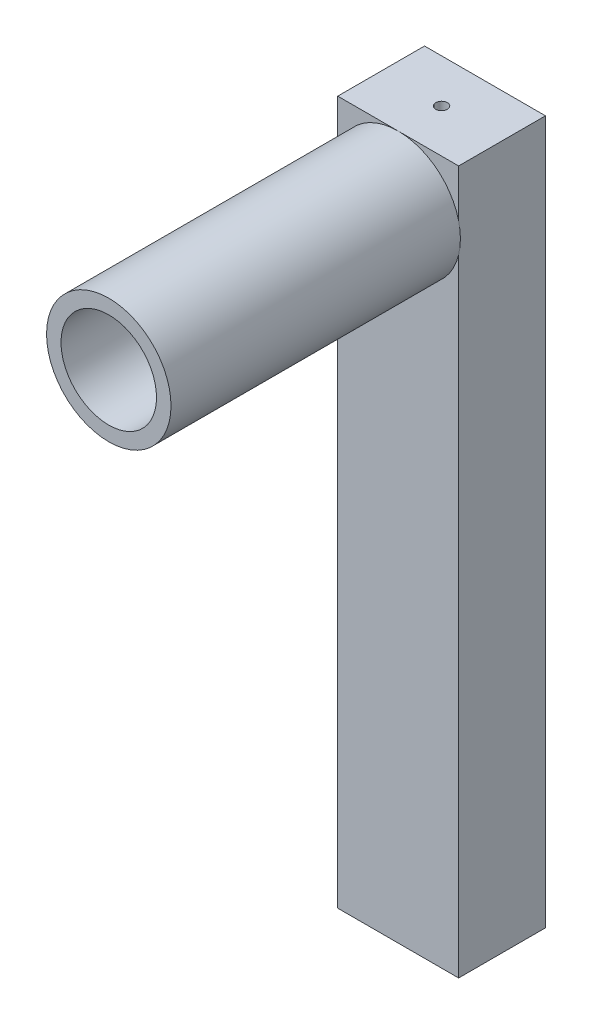
ISO-10303-21;
HEADER;
FILE_DESCRIPTION(('STEP AP214'),'2;1');
FILE_NAME('part.step','',(''),(''),'','','');
FILE_SCHEMA(('AUTOMOTIVE_DESIGN { 1 0 10303 214 1 1 1 1 }'));
ENDSEC;
DATA;
#1=APPLICATION_CONTEXT('core data for automotive mechanical design processes');
#2=APPLICATION_PROTOCOL_DEFINITION('international standard','automotive_design',2000,#1);
#3=PRODUCT_CONTEXT('',#1,'mechanical');
#4=PRODUCT('Part','Part','',(#3));
#5=PRODUCT_RELATED_PRODUCT_CATEGORY('part','',(#4));
#6=PRODUCT_DEFINITION_FORMATION('','',#4);
#7=PRODUCT_DEFINITION_CONTEXT('part definition',#1,'design');
#8=PRODUCT_DEFINITION('design','',#6,#7);
#9=PRODUCT_DEFINITION_SHAPE('','',#8);
#10=(LENGTH_UNIT() NAMED_UNIT(*) SI_UNIT(.MILLI.,.METRE.));
#11=(NAMED_UNIT(*) PLANE_ANGLE_UNIT() SI_UNIT($,.RADIAN.));
#12=(NAMED_UNIT(*) SI_UNIT($,.STERADIAN.) SOLID_ANGLE_UNIT());
#13=UNCERTAINTY_MEASURE_WITH_UNIT(LENGTH_MEASURE(1.E-05),#10,'distance_accuracy_value','');
#14=(GEOMETRIC_REPRESENTATION_CONTEXT(3) GLOBAL_UNCERTAINTY_ASSIGNED_CONTEXT((#13)) GLOBAL_UNIT_ASSIGNED_CONTEXT((#10,
#11,#12)) REPRESENTATION_CONTEXT('',''));
#15=CARTESIAN_POINT('',(0.,0.,0.));
#16=DIRECTION('',(0.,0.,1.));
#17=DIRECTION('',(1.,0.,0.));
#18=AXIS2_PLACEMENT_3D('',#15,#16,#17);
#19=CARTESIAN_POINT('',(0.,0.,0.));
#20=DIRECTION('',(0.,0.,1.));
#21=DIRECTION('',(1.,0.,0.));
#22=AXIS2_PLACEMENT_3D('',#19,#20,#21);
#23=PLANE('',#22);
#24=CARTESIAN_POINT('',(0.,0.,0.));
#25=DIRECTION('',(0.,0.,1.));
#26=DIRECTION('',(1.,0.,0.));
#27=AXIS2_PLACEMENT_3D('',#24,#25,#26);
#28=CIRCLE('',#27,10.75);
#29=CARTESIAN_POINT('',(-10.443642836317,2.54810209910132,0.));
#30=VERTEX_POINT('',#29);
#31=CARTESIAN_POINT('',(-10.443642836317,-2.54810209910132,0.));
#32=VERTEX_POINT('',#31);
#33=EDGE_CURVE('E169',#30,#32,#28,.T.);
#34=ORIENTED_EDGE('',*,*,#33,.F.);
#35=DIRECTION('',(0.,-1.,0.));
#36=VECTOR('',#35,1.);
#37=CARTESIAN_POINT('',(-10.443642836317,-10.75,0.));
#38=LINE('',#37,#36);
#39=EDGE_CURVE('E11',#30,#32,#38,.T.);
#40=ORIENTED_EDGE('',*,*,#39,.T.);
#41=EDGE_LOOP('',(#34,#40));
#42=FACE_BOUND('',#41,.T.);
#43=ADVANCED_FACE('F38',(#42),#23,.F.);
#44=CARTESIAN_POINT('',(0.,0.,50.));
#45=DIRECTION('',(0.,0.,-1.));
#46=DIRECTION('',(-1.,0.,0.));
#47=AXIS2_PLACEMENT_3D('',#44,#45,#46);
#48=CYLINDRICAL_SURFACE('',#47,10.75);
#49=CARTESIAN_POINT('',(0.,0.,50.));
#50=DIRECTION('',(0.,0.,1.));
#51=DIRECTION('',(1.,0.,0.));
#52=AXIS2_PLACEMENT_3D('',#49,#50,#51);
#53=CIRCLE('',#52,10.75);
#54=CARTESIAN_POINT('',(10.75,0.,50.));
#55=VERTEX_POINT('',#54);
#56=EDGE_CURVE('E160',#55,#55,#53,.T.);
#57=ORIENTED_EDGE('',*,*,#56,.F.);
#58=EDGE_LOOP('',(#57));
#59=FACE_BOUND('',#58,.T.);
#60=CARTESIAN_POINT('',(10.443642836317,2.54810209910132,0.));
#61=VERTEX_POINT('',#60);
#62=CARTESIAN_POINT('',(0.,10.75,0.));
#63=VERTEX_POINT('',#62);
#64=EDGE_CURVE('E163',#61,#63,#28,.T.);
#65=ORIENTED_EDGE('',*,*,#64,.T.);
#66=EDGE_CURVE('E66',#63,#30,#28,.T.);
#67=ORIENTED_EDGE('',*,*,#66,.T.);
#68=ORIENTED_EDGE('',*,*,#33,.T.);
#69=CARTESIAN_POINT('',(10.443642836317,-2.54810209910132,0.));
#70=VERTEX_POINT('',#69);
#71=EDGE_CURVE('E105',#32,#70,#28,.T.);
#72=ORIENTED_EDGE('',*,*,#71,.T.);
#73=EDGE_CURVE('E157',#70,#61,#28,.T.);
#74=ORIENTED_EDGE('',*,*,#73,.T.);
#75=EDGE_LOOP('',(#65,#67,#68,#72,#74));
#76=FACE_BOUND('',#75,.T.);
#77=ADVANCED_FACE('F40',(#59,#76),#48,.T.);
#78=CARTESIAN_POINT('',(0.,0.,50.));
#79=DIRECTION('',(0.,0.,1.));
#80=DIRECTION('',(1.,0.,0.));
#81=AXIS2_PLACEMENT_3D('',#78,#79,#80);
#82=PLANE('',#81);
#83=CARTESIAN_POINT('',(0.,0.,50.));
#84=DIRECTION('',(0.,0.,1.));
#85=DIRECTION('',(1.,0.,0.));
#86=AXIS2_PLACEMENT_3D('',#83,#84,#85);
#87=CIRCLE('',#86,8.25);
#88=CARTESIAN_POINT('',(8.25,0.,50.));
#89=VERTEX_POINT('',#88);
#90=EDGE_CURVE('E231',#89,#89,#87,.T.);
#91=ORIENTED_EDGE('',*,*,#90,.F.);
#92=EDGE_LOOP('',(#91));
#93=FACE_BOUND('',#92,.T.);
#94=ORIENTED_EDGE('',*,*,#56,.T.);
#95=EDGE_LOOP('',(#94));
#96=FACE_BOUND('',#95,.T.);
#97=ADVANCED_FACE('F199',(#93,#96),#82,.T.);
#98=ORIENTED_EDGE('',*,*,#73,.F.);
#99=DIRECTION('',(0.,1.,0.));
#100=VECTOR('',#99,1.);
#101=CARTESIAN_POINT('',(10.443642836317,-10.75,0.));
#102=LINE('',#101,#100);
#103=EDGE_CURVE('E48',#70,#61,#102,.T.);
#104=ORIENTED_EDGE('',*,*,#103,.T.);
#105=EDGE_LOOP('',(#98,#104));
#106=FACE_BOUND('',#105,.T.);
#107=ADVANCED_FACE('F188',(#106),#23,.F.);
#108=CARTESIAN_POINT('',(0.,0.,0.));
#109=DIRECTION('',(0.,0.,1.));
#110=DIRECTION('',(1.,0.,0.));
#111=AXIS2_PLACEMENT_3D('',#108,#109,#110);
#112=PLANE('',#111);
#113=ORIENTED_EDGE('',*,*,#64,.F.);
#114=CARTESIAN_POINT('',(10.443642836317,10.75,0.));
#115=VERTEX_POINT('',#114);
#116=EDGE_CURVE('E58',#61,#115,#102,.T.);
#117=ORIENTED_EDGE('',*,*,#116,.T.);
#118=DIRECTION('',(-1.,0.,0.));
#119=VECTOR('',#118,1.);
#120=CARTESIAN_POINT('',(10.443642836317,10.75,0.));
#121=LINE('',#120,#119);
#122=EDGE_CURVE('E136',#115,#63,#121,.T.);
#123=ORIENTED_EDGE('',*,*,#122,.T.);
#124=EDGE_LOOP('',(#113,#117,#123));
#125=FACE_BOUND('',#124,.T.);
#126=ADVANCED_FACE('F192',(#125),#112,.T.);
#127=ORIENTED_EDGE('',*,*,#66,.F.);
#128=CARTESIAN_POINT('',(-10.443642836317,10.75,0.));
#129=VERTEX_POINT('',#128);
#130=EDGE_CURVE('E149',#63,#129,#121,.T.);
#131=ORIENTED_EDGE('',*,*,#130,.T.);
#132=EDGE_CURVE('E50',#129,#30,#38,.T.);
#133=ORIENTED_EDGE('',*,*,#132,.T.);
#134=EDGE_LOOP('',(#127,#131,#133));
#135=FACE_BOUND('',#134,.T.);
#136=ADVANCED_FACE('F177',(#135),#112,.T.);
#137=ORIENTED_EDGE('',*,*,#71,.F.);
#138=CARTESIAN_POINT('',(-10.443642836317,-110.75,0.));
#139=VERTEX_POINT('',#138);
#140=EDGE_CURVE('E51',#32,#139,#38,.T.);
#141=ORIENTED_EDGE('',*,*,#140,.T.);
#142=DIRECTION('',(-1.,0.,0.));
#143=VECTOR('',#142,1.);
#144=CARTESIAN_POINT('',(10.443642836317,-110.75,0.));
#145=LINE('',#144,#143);
#146=CARTESIAN_POINT('',(10.443642836317,-110.75,0.));
#147=VERTEX_POINT('',#146);
#148=EDGE_CURVE('E104',#147,#139,#145,.T.);
#149=ORIENTED_EDGE('',*,*,#148,.F.);
#150=EDGE_CURVE('E146',#147,#70,#102,.T.);
#151=ORIENTED_EDGE('',*,*,#150,.T.);
#152=EDGE_LOOP('',(#137,#141,#149,#151));
#153=FACE_BOUND('',#152,.T.);
#154=ADVANCED_FACE('F102',(#153),#112,.T.);
#155=CARTESIAN_POINT('',(-10.443642836317,-10.75,-15.));
#156=DIRECTION('',(-1.,0.,0.));
#157=DIRECTION('',(0.,0.,1.));
#158=AXIS2_PLACEMENT_3D('',#155,#156,#157);
#159=PLANE('',#158);
#160=ORIENTED_EDGE('',*,*,#132,.F.);
#161=DIRECTION('',(0.,0.,1.));
#162=VECTOR('',#161,1.);
#163=CARTESIAN_POINT('',(-10.443642836317,10.75,-15.));
#164=LINE('',#163,#162);
#165=CARTESIAN_POINT('',(-10.443642836317,10.75,-15.));
#166=VERTEX_POINT('',#165);
#167=EDGE_CURVE('E153',#166,#129,#164,.T.);
#168=ORIENTED_EDGE('',*,*,#167,.F.);
#169=DIRECTION('',(0.,-1.,0.));
#170=VECTOR('',#169,1.);
#171=CARTESIAN_POINT('',(-10.443642836317,-10.75,-15.));
#172=LINE('',#171,#170);
#173=CARTESIAN_POINT('',(-10.443642836317,-110.75,-15.));
#174=VERTEX_POINT('',#173);
#175=EDGE_CURVE('E123',#166,#174,#172,.T.);
#176=ORIENTED_EDGE('',*,*,#175,.T.);
#177=DIRECTION('',(0.,0.,1.));
#178=VECTOR('',#177,1.);
#179=CARTESIAN_POINT('',(-10.443642836317,-110.75,-15.));
#180=LINE('',#179,#178);
#181=EDGE_CURVE('E115',#174,#139,#180,.T.);
#182=ORIENTED_EDGE('',*,*,#181,.T.);
#183=ORIENTED_EDGE('',*,*,#140,.F.);
#184=ORIENTED_EDGE('',*,*,#39,.F.);
#185=EDGE_LOOP('',(#160,#168,#176,#182,#183,#184));
#186=FACE_BOUND('',#185,.T.);
#187=ADVANCED_FACE('F121',(#186),#159,.T.);
#188=CARTESIAN_POINT('',(10.443642836317,10.75,-15.));
#189=DIRECTION('',(0.,1.,0.));
#190=DIRECTION('',(-1.,0.,0.));
#191=AXIS2_PLACEMENT_3D('',#188,#189,#190);
#192=PLANE('',#191);
#193=CARTESIAN_POINT('',(0.,10.75,-7.5));
#194=DIRECTION('',(0.,1.,0.));
#195=DIRECTION('',(-1.,0.,0.));
#196=AXIS2_PLACEMENT_3D('',#193,#194,#195);
#197=CIRCLE('',#196,1.);
#198=CARTESIAN_POINT('',(-1.,10.75,-7.5));
#199=VERTEX_POINT('',#198);
#200=EDGE_CURVE('E223',#199,#199,#197,.T.);
#201=ORIENTED_EDGE('',*,*,#200,.F.);
#202=EDGE_LOOP('',(#201));
#203=FACE_BOUND('',#202,.T.);
#204=ORIENTED_EDGE('',*,*,#122,.F.);
#205=DIRECTION('',(0.,0.,1.));
#206=VECTOR('',#205,1.);
#207=CARTESIAN_POINT('',(10.443642836317,10.75,-15.));
#208=LINE('',#207,#206);
#209=CARTESIAN_POINT('',(10.443642836317,10.75,-15.));
#210=VERTEX_POINT('',#209);
#211=EDGE_CURVE('E143',#210,#115,#208,.T.);
#212=ORIENTED_EDGE('',*,*,#211,.F.);
#213=DIRECTION('',(-1.,0.,0.));
#214=VECTOR('',#213,1.);
#215=CARTESIAN_POINT('',(10.443642836317,10.75,-15.));
#216=LINE('',#215,#214);
#217=EDGE_CURVE('E140',#210,#166,#216,.T.);
#218=ORIENTED_EDGE('',*,*,#217,.T.);
#219=ORIENTED_EDGE('',*,*,#167,.T.);
#220=ORIENTED_EDGE('',*,*,#130,.F.);
#221=EDGE_LOOP('',(#204,#212,#218,#219,#220));
#222=FACE_BOUND('',#221,.T.);
#223=ADVANCED_FACE('F181',(#203,#222),#192,.T.);
#224=CARTESIAN_POINT('',(10.443642836317,-10.75,-15.));
#225=DIRECTION('',(1.,0.,0.));
#226=DIRECTION('',(0.,0.,-1.));
#227=AXIS2_PLACEMENT_3D('',#224,#225,#226);
#228=PLANE('',#227);
#229=ORIENTED_EDGE('',*,*,#150,.F.);
#230=DIRECTION('',(0.,0.,1.));
#231=VECTOR('',#230,1.);
#232=CARTESIAN_POINT('',(10.443642836317,-110.75,-15.));
#233=LINE('',#232,#231);
#234=CARTESIAN_POINT('',(10.443642836317,-110.75,-15.));
#235=VERTEX_POINT('',#234);
#236=EDGE_CURVE('E109',#235,#147,#233,.T.);
#237=ORIENTED_EDGE('',*,*,#236,.F.);
#238=DIRECTION('',(0.,1.,0.));
#239=VECTOR('',#238,1.);
#240=CARTESIAN_POINT('',(10.443642836317,-10.75,-15.));
#241=LINE('',#240,#239);
#242=EDGE_CURVE('E135',#235,#210,#241,.T.);
#243=ORIENTED_EDGE('',*,*,#242,.T.);
#244=ORIENTED_EDGE('',*,*,#211,.T.);
#245=ORIENTED_EDGE('',*,*,#116,.F.);
#246=ORIENTED_EDGE('',*,*,#103,.F.);
#247=EDGE_LOOP('',(#229,#237,#243,#244,#245,#246));
#248=FACE_BOUND('',#247,.T.);
#249=ADVANCED_FACE('F185',(#248),#228,.T.);
#250=CARTESIAN_POINT('',(0.,0.,-15.));
#251=DIRECTION('',(0.,0.,1.));
#252=DIRECTION('',(1.,0.,0.));
#253=AXIS2_PLACEMENT_3D('',#250,#251,#252);
#254=PLANE('',#253);
#255=ORIENTED_EDGE('',*,*,#175,.F.);
#256=ORIENTED_EDGE('',*,*,#217,.F.);
#257=ORIENTED_EDGE('',*,*,#242,.F.);
#258=DIRECTION('',(-1.,0.,0.));
#259=VECTOR('',#258,1.);
#260=CARTESIAN_POINT('',(10.443642836317,-110.75,-15.));
#261=LINE('',#260,#259);
#262=EDGE_CURVE('E125',#235,#174,#261,.T.);
#263=ORIENTED_EDGE('',*,*,#262,.T.);
#264=EDGE_LOOP('',(#255,#256,#257,#263));
#265=FACE_BOUND('',#264,.T.);
#266=ADVANCED_FACE('F184',(#265),#254,.F.);
#267=CARTESIAN_POINT('',(0.,-110.75,0.));
#268=DIRECTION('',(0.,1.,0.));
#269=DIRECTION('',(-1.,0.,0.));
#270=AXIS2_PLACEMENT_3D('',#267,#268,#269);
#271=PLANE('',#270);
#272=CARTESIAN_POINT('',(0.,-110.75,-7.5));
#273=DIRECTION('',(0.,1.,0.));
#274=DIRECTION('',(-1.,0.,0.));
#275=AXIS2_PLACEMENT_3D('',#272,#273,#274);
#276=CIRCLE('',#275,1.);
#277=CARTESIAN_POINT('',(-0.99999999999998,-110.75,-7.5));
#278=VERTEX_POINT('',#277);
#279=EDGE_CURVE('E42',#278,#278,#276,.T.);
#280=ORIENTED_EDGE('',*,*,#279,.T.);
#281=EDGE_LOOP('',(#280));
#282=FACE_BOUND('',#281,.T.);
#283=ORIENTED_EDGE('',*,*,#148,.T.);
#284=ORIENTED_EDGE('',*,*,#181,.F.);
#285=ORIENTED_EDGE('',*,*,#262,.F.);
#286=ORIENTED_EDGE('',*,*,#236,.T.);
#287=EDGE_LOOP('',(#283,#284,#285,#286));
#288=FACE_BOUND('',#287,.T.);
#289=ADVANCED_FACE('F113',(#282,#288),#271,.F.);
#290=CARTESIAN_POINT('',(0.,-119.25,-7.5));
#291=DIRECTION('',(0.,1.,0.));
#292=DIRECTION('',(-1.,0.,0.));
#293=AXIS2_PLACEMENT_3D('',#290,#291,#292);
#294=CYLINDRICAL_SURFACE('',#293,1.);
#295=ORIENTED_EDGE('',*,*,#200,.T.);
#296=EDGE_LOOP('',(#295));
#297=FACE_BOUND('',#296,.T.);
#298=ORIENTED_EDGE('',*,*,#279,.F.);
#299=EDGE_LOOP('',(#298));
#300=FACE_BOUND('',#299,.T.);
#301=ADVANCED_FACE('F243',(#297,#300),#294,.F.);
#302=CARTESIAN_POINT('',(0.,0.,0.));
#303=DIRECTION('',(0.,0.,1.));
#304=DIRECTION('',(1.,0.,0.));
#305=AXIS2_PLACEMENT_3D('',#302,#303,#304);
#306=CYLINDRICAL_SURFACE('',#305,8.25);
#307=CARTESIAN_POINT('',(0.,0.,0.));
#308=DIRECTION('',(0.,0.,1.));
#309=DIRECTION('',(1.,0.,0.));
#310=AXIS2_PLACEMENT_3D('',#307,#308,#309);
#311=CIRCLE('',#310,8.25);
#312=CARTESIAN_POINT('',(8.25,0.,0.));
#313=VERTEX_POINT('',#312);
#314=EDGE_CURVE('E226',#313,#313,#311,.T.);
#315=ORIENTED_EDGE('',*,*,#314,.F.);
#316=EDGE_LOOP('',(#315));
#317=FACE_BOUND('',#316,.T.);
#318=ORIENTED_EDGE('',*,*,#90,.T.);
#319=EDGE_LOOP('',(#318));
#320=FACE_BOUND('',#319,.T.);
#321=ADVANCED_FACE('F238',(#317,#320),#306,.F.);
#322=CARTESIAN_POINT('',(0.,0.,0.));
#323=DIRECTION('',(0.,0.,1.));
#324=DIRECTION('',(1.,0.,0.));
#325=AXIS2_PLACEMENT_3D('',#322,#323,#324);
#326=PLANE('',#325);
#327=ORIENTED_EDGE('',*,*,#314,.T.);
#328=EDGE_LOOP('',(#327));
#329=FACE_BOUND('',#328,.T.);
#330=ADVANCED_FACE('F242',(#329),#326,.T.);
#331=CLOSED_SHELL('',(#43,#77,#97,#107,#126,#136,#154,#187,#223,#249,#266,#289,#301,#321,#330));
#332=MANIFOLD_SOLID_BREP('B2',#331);
#333=ADVANCED_BREP_SHAPE_REPRESENTATION('',(#18,#332),#14);
#334=SHAPE_DEFINITION_REPRESENTATION(#9,#333);
ENDSEC;
END-ISO-10303-21;
